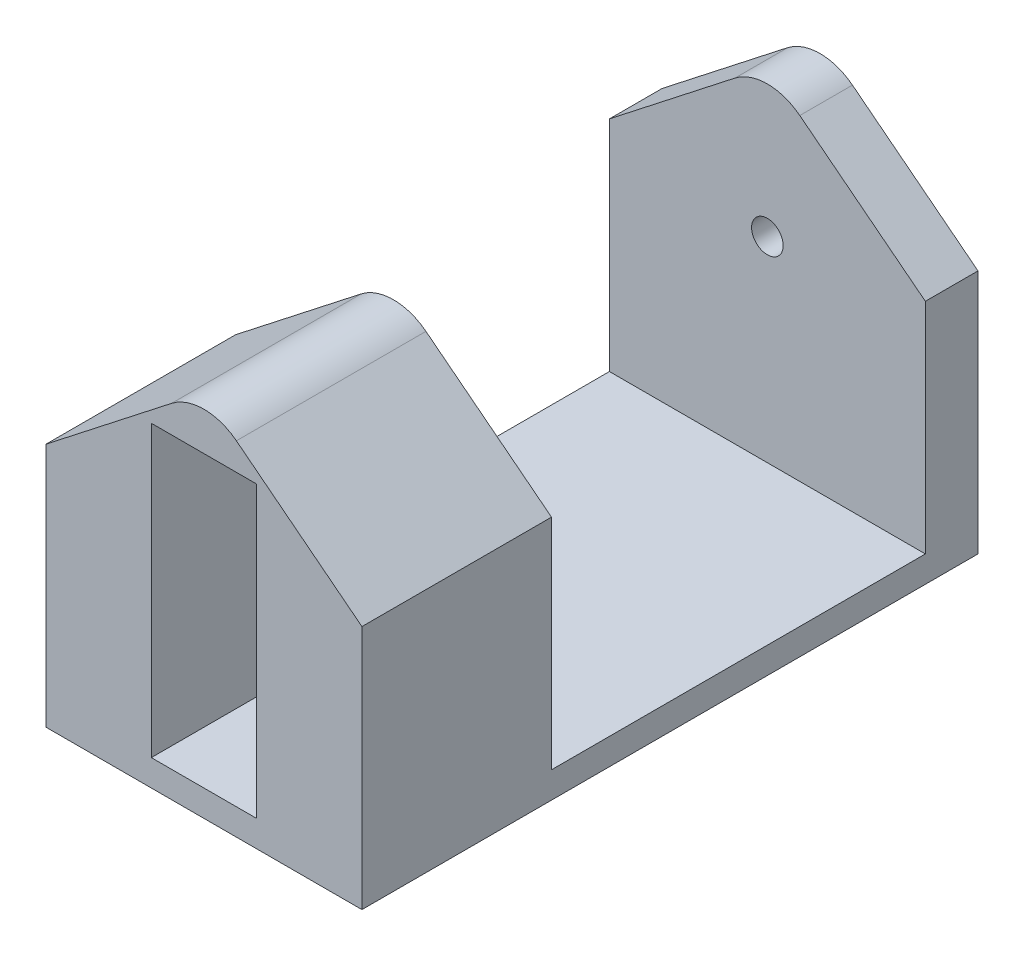
ISO-10303-21;
HEADER;
FILE_DESCRIPTION(('STEP AP214'),'2;1');
FILE_NAME('part.step','',(''),(''),'','','');
FILE_SCHEMA(('AUTOMOTIVE_DESIGN { 1 0 10303 214 1 1 1 1 }'));
ENDSEC;
DATA;
#1=APPLICATION_CONTEXT('core data for automotive mechanical design processes');
#2=APPLICATION_PROTOCOL_DEFINITION('international standard','automotive_design',2000,#1);
#3=PRODUCT_CONTEXT('',#1,'mechanical');
#4=PRODUCT('Part','Part','',(#3));
#5=PRODUCT_RELATED_PRODUCT_CATEGORY('part','',(#4));
#6=PRODUCT_DEFINITION_FORMATION('','',#4);
#7=PRODUCT_DEFINITION_CONTEXT('part definition',#1,'design');
#8=PRODUCT_DEFINITION('design','',#6,#7);
#9=PRODUCT_DEFINITION_SHAPE('','',#8);
#10=(LENGTH_UNIT() NAMED_UNIT(*) SI_UNIT(.MILLI.,.METRE.));
#11=(NAMED_UNIT(*) PLANE_ANGLE_UNIT() SI_UNIT($,.RADIAN.));
#12=(NAMED_UNIT(*) SI_UNIT($,.STERADIAN.) SOLID_ANGLE_UNIT());
#13=UNCERTAINTY_MEASURE_WITH_UNIT(LENGTH_MEASURE(1.E-05),#10,'distance_accuracy_value','');
#14=(GEOMETRIC_REPRESENTATION_CONTEXT(3) GLOBAL_UNCERTAINTY_ASSIGNED_CONTEXT((#13)) GLOBAL_UNIT_ASSIGNED_CONTEXT((#10,
#11,#12)) REPRESENTATION_CONTEXT('',''));
#15=CARTESIAN_POINT('',(0.,0.,0.));
#16=DIRECTION('',(0.,0.,1.));
#17=DIRECTION('',(1.,0.,0.));
#18=AXIS2_PLACEMENT_3D('',#15,#16,#17);
#19=CARTESIAN_POINT('',(-40.,70.,-58.5));
#20=DIRECTION('',(0.,0.,1.));
#21=DIRECTION('',(1.,0.,0.));
#22=AXIS2_PLACEMENT_3D('',#19,#20,#21);
#23=PLANE('',#22);
#24=CARTESIAN_POINT('',(0.,42.2,-58.5));
#25=DIRECTION('',(0.,0.,1.));
#26=DIRECTION('',(1.,0.,0.));
#27=AXIS2_PLACEMENT_3D('',#24,#25,#26);
#28=CIRCLE('',#27,3.);
#29=CARTESIAN_POINT('',(3.00000000000001,42.2,-58.5));
#30=VERTEX_POINT('',#29);
#31=EDGE_CURVE('E311',#30,#30,#28,.T.);
#32=ORIENTED_EDGE('',*,*,#31,.T.);
#33=EDGE_LOOP('',(#32));
#34=FACE_BOUND('',#33,.T.);
#35=DIRECTION('',(-1.,0.,0.));
#36=VECTOR('',#35,1.);
#37=CARTESIAN_POINT('',(-40.,0.,-58.5));
#38=LINE('',#37,#36);
#39=CARTESIAN_POINT('',(30.,0.,-58.5));
#40=VERTEX_POINT('',#39);
#41=CARTESIAN_POINT('',(-30.,0.,-58.5));
#42=VERTEX_POINT('',#41);
#43=EDGE_CURVE('E177',#40,#42,#38,.T.);
#44=ORIENTED_EDGE('',*,*,#43,.T.);
#45=DIRECTION('',(0.,1.,0.));
#46=VECTOR('',#45,1.);
#47=CARTESIAN_POINT('',(-30.,0.,-58.5));
#48=LINE('',#47,#46);
#49=CARTESIAN_POINT('',(-30.,46.5542287156581,-58.5));
#50=VERTEX_POINT('',#49);
#51=EDGE_CURVE('E154',#42,#50,#48,.T.);
#52=ORIENTED_EDGE('',*,*,#51,.T.);
#53=DIRECTION('',(0.787918971406133,0.615778933139404,0.));
#54=VECTOR('',#53,1.);
#55=CARTESIAN_POINT('',(-6.15778933139407,65.1875293239658,-58.5));
#56=LINE('',#55,#54);
#57=CARTESIAN_POINT('',(-6.15778933139407,65.1875293239658,-58.5));
#58=VERTEX_POINT('',#57);
#59=EDGE_CURVE('E205',#50,#58,#56,.T.);
#60=ORIENTED_EDGE('',*,*,#59,.T.);
#61=CARTESIAN_POINT('',(0.,57.3083396099045,-58.5));
#62=DIRECTION('',(0.,0.,-1.));
#63=DIRECTION('',(-1.,0.,0.));
#64=AXIS2_PLACEMENT_3D('',#61,#62,#63);
#65=CIRCLE('',#64,10.);
#66=CARTESIAN_POINT('',(6.15778933139409,65.1875293239658,-58.5));
#67=VERTEX_POINT('',#66);
#68=EDGE_CURVE('E291',#58,#67,#65,.T.);
#69=ORIENTED_EDGE('',*,*,#68,.T.);
#70=DIRECTION('',(0.787918971406133,-0.615778933139404,0.));
#71=VECTOR('',#70,1.);
#72=CARTESIAN_POINT('',(6.15778933139409,65.1875293239658,-58.5));
#73=LINE('',#72,#71);
#74=CARTESIAN_POINT('',(30.,46.5542287156581,-58.5));
#75=VERTEX_POINT('',#74);
#76=EDGE_CURVE('E286',#67,#75,#73,.T.);
#77=ORIENTED_EDGE('',*,*,#76,.T.);
#78=DIRECTION('',(0.,1.,0.));
#79=VECTOR('',#78,1.);
#80=CARTESIAN_POINT('',(30.,0.,-58.5));
#81=LINE('',#80,#79);
#82=EDGE_CURVE('E53',#40,#75,#81,.T.);
#83=ORIENTED_EDGE('',*,*,#82,.F.);
#84=EDGE_LOOP('',(#44,#52,#60,#69,#77,#83));
#85=FACE_BOUND('',#84,.T.);
#86=ADVANCED_FACE('F38',(#34,#85),#23,.F.);
#87=CARTESIAN_POINT('',(-40.,70.,58.5));
#88=DIRECTION('',(0.,0.,-1.));
#89=DIRECTION('',(-1.,0.,0.));
#90=AXIS2_PLACEMENT_3D('',#87,#88,#89);
#91=PLANE('',#90);
#92=DIRECTION('',(1.,0.,0.));
#93=VECTOR('',#92,1.);
#94=CARTESIAN_POINT('',(-9.99999999999999,5.,58.5));
#95=LINE('',#94,#93);
#96=CARTESIAN_POINT('',(-9.99999999999999,5.00000000000001,58.5));
#97=VERTEX_POINT('',#96);
#98=CARTESIAN_POINT('',(10.,5.,58.5));
#99=VERTEX_POINT('',#98);
#100=EDGE_CURVE('E231',#97,#99,#95,.T.);
#101=ORIENTED_EDGE('',*,*,#100,.F.);
#102=DIRECTION('',(0.,-1.,0.));
#103=VECTOR('',#102,1.);
#104=CARTESIAN_POINT('',(-9.99999999999999,5.,58.5));
#105=LINE('',#104,#103);
#106=CARTESIAN_POINT('',(-9.99999999999999,60.,58.5));
#107=VERTEX_POINT('',#106);
#108=EDGE_CURVE('E228',#107,#97,#105,.T.);
#109=ORIENTED_EDGE('',*,*,#108,.F.);
#110=DIRECTION('',(-1.,0.,0.));
#111=VECTOR('',#110,1.);
#112=CARTESIAN_POINT('',(-9.99999999999999,60.,58.5));
#113=LINE('',#112,#111);
#114=CARTESIAN_POINT('',(9.99999999999999,60.,58.5));
#115=VERTEX_POINT('',#114);
#116=EDGE_CURVE('E239',#115,#107,#113,.T.);
#117=ORIENTED_EDGE('',*,*,#116,.F.);
#118=DIRECTION('',(0.,1.,0.));
#119=VECTOR('',#118,1.);
#120=CARTESIAN_POINT('',(9.99999999999999,60.,58.5));
#121=LINE('',#120,#119);
#122=EDGE_CURVE('E235',#99,#115,#121,.T.);
#123=ORIENTED_EDGE('',*,*,#122,.F.);
#124=EDGE_LOOP('',(#101,#109,#117,#123));
#125=FACE_BOUND('',#124,.T.);
#126=DIRECTION('',(0.787918971406133,0.615778933139404,0.));
#127=VECTOR('',#126,1.);
#128=CARTESIAN_POINT('',(-6.15778933139407,65.1875293239658,58.5));
#129=LINE('',#128,#127);
#130=CARTESIAN_POINT('',(-30.,46.5542287156581,58.5));
#131=VERTEX_POINT('',#130);
#132=CARTESIAN_POINT('',(-6.15778933139407,65.1875293239658,58.5));
#133=VERTEX_POINT('',#132);
#134=EDGE_CURVE('E169',#131,#133,#129,.T.);
#135=ORIENTED_EDGE('',*,*,#134,.F.);
#136=DIRECTION('',(0.,1.,0.));
#137=VECTOR('',#136,1.);
#138=CARTESIAN_POINT('',(-30.,0.,58.5));
#139=LINE('',#138,#137);
#140=CARTESIAN_POINT('',(-30.,0.,58.5));
#141=VERTEX_POINT('',#140);
#142=EDGE_CURVE('E151',#141,#131,#139,.T.);
#143=ORIENTED_EDGE('',*,*,#142,.F.);
#144=DIRECTION('',(1.,0.,0.));
#145=VECTOR('',#144,1.);
#146=CARTESIAN_POINT('',(-40.,0.,58.5));
#147=LINE('',#146,#145);
#148=CARTESIAN_POINT('',(30.,0.,58.5));
#149=VERTEX_POINT('',#148);
#150=EDGE_CURVE('E167',#141,#149,#147,.T.);
#151=ORIENTED_EDGE('',*,*,#150,.T.);
#152=DIRECTION('',(0.,1.,0.));
#153=VECTOR('',#152,1.);
#154=CARTESIAN_POINT('',(30.,0.,58.5));
#155=LINE('',#154,#153);
#156=CARTESIAN_POINT('',(30.,46.5542287156581,58.5));
#157=VERTEX_POINT('',#156);
#158=EDGE_CURVE('E160',#149,#157,#155,.T.);
#159=ORIENTED_EDGE('',*,*,#158,.T.);
#160=DIRECTION('',(0.787918971406133,-0.615778933139404,0.));
#161=VECTOR('',#160,1.);
#162=CARTESIAN_POINT('',(6.15778933139409,65.1875293239658,58.5));
#163=LINE('',#162,#161);
#164=CARTESIAN_POINT('',(6.15778933139409,65.1875293239658,58.5));
#165=VERTEX_POINT('',#164);
#166=EDGE_CURVE('E314',#165,#157,#163,.T.);
#167=ORIENTED_EDGE('',*,*,#166,.F.);
#168=CARTESIAN_POINT('',(0.,57.3083396099045,58.5));
#169=DIRECTION('',(0.,0.,-1.));
#170=DIRECTION('',(-1.,0.,0.));
#171=AXIS2_PLACEMENT_3D('',#168,#169,#170);
#172=CIRCLE('',#171,10.);
#173=EDGE_CURVE('E310',#133,#165,#172,.T.);
#174=ORIENTED_EDGE('',*,*,#173,.F.);
#175=EDGE_LOOP('',(#135,#143,#151,#159,#167,#174));
#176=FACE_BOUND('',#175,.T.);
#177=ADVANCED_FACE('F165',(#125,#176),#91,.F.);
#178=CARTESIAN_POINT('',(0.,0.,0.));
#179=DIRECTION('',(0.,1.,0.));
#180=DIRECTION('',(0.,0.,1.));
#181=AXIS2_PLACEMENT_3D('',#178,#179,#180);
#182=PLANE('',#181);
#183=ORIENTED_EDGE('',*,*,#150,.F.);
#184=DIRECTION('',(0.,0.,-1.));
#185=VECTOR('',#184,1.);
#186=CARTESIAN_POINT('',(-30.,0.,58.5));
#187=LINE('',#186,#185);
#188=EDGE_CURVE('E148',#141,#42,#187,.T.);
#189=ORIENTED_EDGE('',*,*,#188,.T.);
#190=ORIENTED_EDGE('',*,*,#43,.F.);
#191=DIRECTION('',(0.,0.,1.));
#192=VECTOR('',#191,1.);
#193=CARTESIAN_POINT('',(30.,0.,58.5));
#194=LINE('',#193,#192);
#195=EDGE_CURVE('E174',#40,#149,#194,.T.);
#196=ORIENTED_EDGE('',*,*,#195,.T.);
#197=EDGE_LOOP('',(#183,#189,#190,#196));
#198=FACE_BOUND('',#197,.T.);
#199=ADVANCED_FACE('F173',(#198),#182,.F.);
#200=CARTESIAN_POINT('',(-40.,5.,-48.5));
#201=DIRECTION('',(0.,0.,-1.));
#202=DIRECTION('',(-1.,0.,0.));
#203=AXIS2_PLACEMENT_3D('',#200,#201,#202);
#204=PLANE('',#203);
#205=CARTESIAN_POINT('',(0.,42.2,-48.5));
#206=DIRECTION('',(0.,0.,1.));
#207=DIRECTION('',(1.,0.,0.));
#208=AXIS2_PLACEMENT_3D('',#205,#206,#207);
#209=CIRCLE('',#208,3.);
#210=CARTESIAN_POINT('',(3.00000000000001,42.2,-48.5));
#211=VERTEX_POINT('',#210);
#212=EDGE_CURVE('E325',#211,#211,#209,.T.);
#213=ORIENTED_EDGE('',*,*,#212,.F.);
#214=EDGE_LOOP('',(#213));
#215=FACE_BOUND('',#214,.T.);
#216=DIRECTION('',(-0.787918971406133,-0.615778933139404,0.));
#217=VECTOR('',#216,1.);
#218=CARTESIAN_POINT('',(-56.3696059548976,25.9457037130998,-48.5));
#219=LINE('',#218,#217);
#220=CARTESIAN_POINT('',(-6.15778933139407,65.1875293239658,-48.5));
#221=VERTEX_POINT('',#220);
#222=CARTESIAN_POINT('',(-30.,46.5542287156581,-48.5));
#223=VERTEX_POINT('',#222);
#224=EDGE_CURVE('E203',#221,#223,#219,.T.);
#225=ORIENTED_EDGE('',*,*,#224,.T.);
#226=DIRECTION('',(0.,-1.,0.));
#227=VECTOR('',#226,1.);
#228=CARTESIAN_POINT('',(-30.,5.,-48.5));
#229=LINE('',#228,#227);
#230=CARTESIAN_POINT('',(-30.,5.,-48.5));
#231=VERTEX_POINT('',#230);
#232=EDGE_CURVE('E60',#223,#231,#229,.T.);
#233=ORIENTED_EDGE('',*,*,#232,.T.);
#234=DIRECTION('',(-1.,0.,0.));
#235=VECTOR('',#234,1.);
#236=CARTESIAN_POINT('',(-40.,5.,-48.5));
#237=LINE('',#236,#235);
#238=CARTESIAN_POINT('',(30.,5.,-48.5));
#239=VERTEX_POINT('',#238);
#240=EDGE_CURVE('E184',#239,#231,#237,.T.);
#241=ORIENTED_EDGE('',*,*,#240,.F.);
#242=DIRECTION('',(0.,1.,0.));
#243=VECTOR('',#242,1.);
#244=CARTESIAN_POINT('',(30.,5.,-48.5));
#245=LINE('',#244,#243);
#246=CARTESIAN_POINT('',(30.,46.5542287156581,-48.5));
#247=VERTEX_POINT('',#246);
#248=EDGE_CURVE('E277',#239,#247,#245,.T.);
#249=ORIENTED_EDGE('',*,*,#248,.T.);
#250=DIRECTION('',(-0.787918971406133,0.615778933139404,0.));
#251=VECTOR('',#250,1.);
#252=CARTESIAN_POINT('',(6.70430151476178,64.760416002121,-48.5));
#253=LINE('',#252,#251);
#254=CARTESIAN_POINT('',(6.15778933139409,65.1875293239658,-48.5));
#255=VERTEX_POINT('',#254);
#256=EDGE_CURVE('E218',#247,#255,#253,.T.);
#257=ORIENTED_EDGE('',*,*,#256,.T.);
#258=CARTESIAN_POINT('',(0.,57.3083396099045,-48.5));
#259=DIRECTION('',(0.,0.,-1.));
#260=DIRECTION('',(-1.,0.,0.));
#261=AXIS2_PLACEMENT_3D('',#258,#259,#260);
#262=CIRCLE('',#261,10.);
#263=EDGE_CURVE('E212',#255,#221,#262,.F.);
#264=ORIENTED_EDGE('',*,*,#263,.T.);
#265=EDGE_LOOP('',(#225,#233,#241,#249,#257,#264));
#266=FACE_BOUND('',#265,.T.);
#267=ADVANCED_FACE('F208',(#215,#266),#204,.F.);
#268=CARTESIAN_POINT('',(-40.,5.,22.5));
#269=DIRECTION('',(0.,0.,1.));
#270=DIRECTION('',(1.,0.,0.));
#271=AXIS2_PLACEMENT_3D('',#268,#269,#270);
#272=PLANE('',#271);
#273=DIRECTION('',(1.,0.,0.));
#274=VECTOR('',#273,1.);
#275=CARTESIAN_POINT('',(-40.,5.,22.5));
#276=LINE('',#275,#274);
#277=CARTESIAN_POINT('',(-30.,5.,22.5));
#278=VERTEX_POINT('',#277);
#279=CARTESIAN_POINT('',(-9.99999999999999,5.,22.5));
#280=VERTEX_POINT('',#279);
#281=EDGE_CURVE('E265',#278,#280,#276,.T.);
#282=ORIENTED_EDGE('',*,*,#281,.F.);
#283=DIRECTION('',(0.,1.,0.));
#284=VECTOR('',#283,1.);
#285=CARTESIAN_POINT('',(-30.,5.,22.5));
#286=LINE('',#285,#284);
#287=CARTESIAN_POINT('',(-30.,46.5542287156581,22.5));
#288=VERTEX_POINT('',#287);
#289=EDGE_CURVE('E340',#278,#288,#286,.T.);
#290=ORIENTED_EDGE('',*,*,#289,.T.);
#291=DIRECTION('',(0.787918971406133,0.615778933139404,0.));
#292=VECTOR('',#291,1.);
#293=CARTESIAN_POINT('',(-56.3696059548976,25.9457037130998,22.5));
#294=LINE('',#293,#292);
#295=CARTESIAN_POINT('',(-6.15778933139407,65.1875293239658,22.5));
#296=VERTEX_POINT('',#295);
#297=EDGE_CURVE('E182',#288,#296,#294,.T.);
#298=ORIENTED_EDGE('',*,*,#297,.T.);
#299=CARTESIAN_POINT('',(0.,57.3083396099045,22.5));
#300=DIRECTION('',(0.,0.,1.));
#301=DIRECTION('',(1.,0.,0.));
#302=AXIS2_PLACEMENT_3D('',#299,#300,#301);
#303=CIRCLE('',#302,10.);
#304=CARTESIAN_POINT('',(6.15778933139409,65.1875293239658,22.5));
#305=VERTEX_POINT('',#304);
#306=EDGE_CURVE('E190',#296,#305,#303,.F.);
#307=ORIENTED_EDGE('',*,*,#306,.T.);
#308=DIRECTION('',(0.787918971406133,-0.615778933139404,0.));
#309=VECTOR('',#308,1.);
#310=CARTESIAN_POINT('',(6.70430151476178,64.760416002121,22.5));
#311=LINE('',#310,#309);
#312=CARTESIAN_POINT('',(30.,46.5542287156581,22.5));
#313=VERTEX_POINT('',#312);
#314=EDGE_CURVE('E194',#305,#313,#311,.T.);
#315=ORIENTED_EDGE('',*,*,#314,.T.);
#316=DIRECTION('',(0.,-1.,0.));
#317=VECTOR('',#316,1.);
#318=CARTESIAN_POINT('',(30.,5.,22.5));
#319=LINE('',#318,#317);
#320=CARTESIAN_POINT('',(30.,5.,22.5));
#321=VERTEX_POINT('',#320);
#322=EDGE_CURVE('E332',#313,#321,#319,.T.);
#323=ORIENTED_EDGE('',*,*,#322,.T.);
#324=CARTESIAN_POINT('',(10.,5.,22.5));
#325=VERTEX_POINT('',#324);
#326=EDGE_CURVE('E264',#325,#321,#276,.T.);
#327=ORIENTED_EDGE('',*,*,#326,.F.);
#328=DIRECTION('',(0.,1.,0.));
#329=VECTOR('',#328,1.);
#330=CARTESIAN_POINT('',(10.,5.00000000000002,22.5));
#331=LINE('',#330,#329);
#332=CARTESIAN_POINT('',(9.99999999999999,60.,22.5));
#333=VERTEX_POINT('',#332);
#334=EDGE_CURVE('E247',#325,#333,#331,.T.);
#335=ORIENTED_EDGE('',*,*,#334,.T.);
#336=DIRECTION('',(-1.,0.,0.));
#337=VECTOR('',#336,1.);
#338=CARTESIAN_POINT('',(-40.,60.,22.5));
#339=LINE('',#338,#337);
#340=CARTESIAN_POINT('',(-9.99999999999999,60.,22.5));
#341=VERTEX_POINT('',#340);
#342=EDGE_CURVE('E176',#333,#341,#339,.T.);
#343=ORIENTED_EDGE('',*,*,#342,.T.);
#344=DIRECTION('',(0.,-1.,0.));
#345=VECTOR('',#344,1.);
#346=CARTESIAN_POINT('',(-9.99999999999999,5.,22.5));
#347=LINE('',#346,#345);
#348=EDGE_CURVE('E260',#341,#280,#347,.T.);
#349=ORIENTED_EDGE('',*,*,#348,.T.);
#350=EDGE_LOOP('',(#282,#290,#298,#307,#315,#323,#327,#335,#343,#349));
#351=FACE_BOUND('',#350,.T.);
#352=ADVANCED_FACE('F397',(#351),#272,.F.);
#353=CARTESIAN_POINT('',(0.,5.,0.));
#354=DIRECTION('',(0.,1.,0.));
#355=DIRECTION('',(0.,0.,1.));
#356=AXIS2_PLACEMENT_3D('',#353,#354,#355);
#357=PLANE('',#356);
#358=DIRECTION('',(0.,0.,-1.));
#359=VECTOR('',#358,1.);
#360=CARTESIAN_POINT('',(-30.,5.,0.));
#361=LINE('',#360,#359);
#362=EDGE_CURVE('E272',#278,#231,#361,.T.);
#363=ORIENTED_EDGE('',*,*,#362,.F.);
#364=ORIENTED_EDGE('',*,*,#281,.T.);
#365=DIRECTION('',(0.,0.,1.));
#366=VECTOR('',#365,1.);
#367=CARTESIAN_POINT('',(-9.99999999999999,5.,-6.50000000000001));
#368=LINE('',#367,#366);
#369=EDGE_CURVE('E243',#280,#97,#368,.T.);
#370=ORIENTED_EDGE('',*,*,#369,.T.);
#371=ORIENTED_EDGE('',*,*,#100,.T.);
#372=DIRECTION('',(0.,0.,1.));
#373=VECTOR('',#372,1.);
#374=CARTESIAN_POINT('',(10.,5.,-6.50000000000001));
#375=LINE('',#374,#373);
#376=EDGE_CURVE('E251',#325,#99,#375,.T.);
#377=ORIENTED_EDGE('',*,*,#376,.F.);
#378=ORIENTED_EDGE('',*,*,#326,.T.);
#379=DIRECTION('',(0.,0.,1.));
#380=VECTOR('',#379,1.);
#381=CARTESIAN_POINT('',(30.,5.,0.));
#382=LINE('',#381,#380);
#383=EDGE_CURVE('E275',#239,#321,#382,.T.);
#384=ORIENTED_EDGE('',*,*,#383,.F.);
#385=ORIENTED_EDGE('',*,*,#240,.T.);
#386=EDGE_LOOP('',(#363,#364,#370,#371,#377,#378,#384,#385));
#387=FACE_BOUND('',#386,.T.);
#388=ADVANCED_FACE('F271',(#387),#357,.T.);
#389=CARTESIAN_POINT('',(-9.99999999999999,60.,-6.50000000000001));
#390=DIRECTION('',(0.,1.,0.));
#391=DIRECTION('',(-1.,0.,0.));
#392=AXIS2_PLACEMENT_3D('',#389,#390,#391);
#393=PLANE('',#392);
#394=DIRECTION('',(0.,0.,1.));
#395=VECTOR('',#394,1.);
#396=CARTESIAN_POINT('',(9.99999999999999,60.,-6.50000000000001));
#397=LINE('',#396,#395);
#398=EDGE_CURVE('E248',#333,#115,#397,.T.);
#399=ORIENTED_EDGE('',*,*,#398,.T.);
#400=ORIENTED_EDGE('',*,*,#116,.T.);
#401=DIRECTION('',(0.,0.,1.));
#402=VECTOR('',#401,1.);
#403=CARTESIAN_POINT('',(-9.99999999999999,60.,-6.50000000000001));
#404=LINE('',#403,#402);
#405=EDGE_CURVE('E244',#341,#107,#404,.T.);
#406=ORIENTED_EDGE('',*,*,#405,.F.);
#407=ORIENTED_EDGE('',*,*,#342,.F.);
#408=EDGE_LOOP('',(#399,#400,#406,#407));
#409=FACE_BOUND('',#408,.T.);
#410=ADVANCED_FACE('F383',(#409),#393,.F.);
#411=CARTESIAN_POINT('',(-9.99999999999999,5.,-6.50000000000001));
#412=DIRECTION('',(-1.,0.,0.));
#413=DIRECTION('',(0.,0.,1.));
#414=AXIS2_PLACEMENT_3D('',#411,#412,#413);
#415=PLANE('',#414);
#416=ORIENTED_EDGE('',*,*,#405,.T.);
#417=ORIENTED_EDGE('',*,*,#108,.T.);
#418=ORIENTED_EDGE('',*,*,#369,.F.);
#419=ORIENTED_EDGE('',*,*,#348,.F.);
#420=EDGE_LOOP('',(#416,#417,#418,#419));
#421=FACE_BOUND('',#420,.T.);
#422=ADVANCED_FACE('F386',(#421),#415,.F.);
#423=CARTESIAN_POINT('',(9.99999999999999,60.,-6.50000000000001));
#424=DIRECTION('',(1.,0.,0.));
#425=DIRECTION('',(0.,1.,0.));
#426=AXIS2_PLACEMENT_3D('',#423,#424,#425);
#427=PLANE('',#426);
#428=ORIENTED_EDGE('',*,*,#376,.T.);
#429=ORIENTED_EDGE('',*,*,#122,.T.);
#430=ORIENTED_EDGE('',*,*,#398,.F.);
#431=ORIENTED_EDGE('',*,*,#334,.F.);
#432=EDGE_LOOP('',(#428,#429,#430,#431));
#433=FACE_BOUND('',#432,.T.);
#434=ADVANCED_FACE('F388',(#433),#427,.F.);
#435=CARTESIAN_POINT('',(-6.15778933139407,65.1875293239658,-58.5));
#436=DIRECTION('',(0.615778933139404,-0.787918971406132,0.));
#437=DIRECTION('',(0.787918971406133,0.615778933139404,0.));
#438=AXIS2_PLACEMENT_3D('',#435,#436,#437);
#439=PLANE('',#438);
#440=ORIENTED_EDGE('',*,*,#297,.F.);
#441=DIRECTION('',(0.,0.,1.));
#442=VECTOR('',#441,1.);
#443=CARTESIAN_POINT('',(-30.,46.5542287156581,-58.5));
#444=LINE('',#443,#442);
#445=EDGE_CURVE('E280',#288,#131,#444,.T.);
#446=ORIENTED_EDGE('',*,*,#445,.T.);
#447=ORIENTED_EDGE('',*,*,#134,.T.);
#448=DIRECTION('',(0.,0.,1.));
#449=VECTOR('',#448,1.);
#450=CARTESIAN_POINT('',(-6.15778933139407,65.1875293239658,-58.5));
#451=LINE('',#450,#449);
#452=EDGE_CURVE('E293',#296,#133,#451,.T.);
#453=ORIENTED_EDGE('',*,*,#452,.F.);
#454=EDGE_LOOP('',(#440,#446,#447,#453));
#455=FACE_BOUND('',#454,.T.);
#456=ADVANCED_FACE('F374',(#455),#439,.F.);
#457=CARTESIAN_POINT('',(0.,57.3083396099045,-58.5));
#458=DIRECTION('',(0.,0.,1.));
#459=DIRECTION('',(1.,0.,0.));
#460=AXIS2_PLACEMENT_3D('',#457,#458,#459);
#461=CYLINDRICAL_SURFACE('',#460,10.);
#462=ORIENTED_EDGE('',*,*,#452,.T.);
#463=ORIENTED_EDGE('',*,*,#173,.T.);
#464=DIRECTION('',(0.,0.,1.));
#465=VECTOR('',#464,1.);
#466=CARTESIAN_POINT('',(6.15778933139409,65.1875293239658,-58.5));
#467=LINE('',#466,#465);
#468=EDGE_CURVE('E221',#305,#165,#467,.T.);
#469=ORIENTED_EDGE('',*,*,#468,.F.);
#470=ORIENTED_EDGE('',*,*,#306,.F.);
#471=EDGE_LOOP('',(#462,#463,#469,#470));
#472=FACE_BOUND('',#471,.T.);
#473=ADVANCED_FACE('F381',(#472),#461,.T.);
#474=CARTESIAN_POINT('',(6.15778933139409,65.1875293239658,-58.5));
#475=DIRECTION('',(-0.615778933139404,-0.787918971406132,0.));
#476=DIRECTION('',(0.787918971406133,-0.615778933139404,0.));
#477=AXIS2_PLACEMENT_3D('',#474,#475,#476);
#478=PLANE('',#477);
#479=ORIENTED_EDGE('',*,*,#166,.T.);
#480=DIRECTION('',(0.,0.,-1.));
#481=VECTOR('',#480,1.);
#482=CARTESIAN_POINT('',(30.,46.5542287156581,-58.5));
#483=LINE('',#482,#481);
#484=EDGE_CURVE('E329',#157,#313,#483,.T.);
#485=ORIENTED_EDGE('',*,*,#484,.T.);
#486=ORIENTED_EDGE('',*,*,#314,.F.);
#487=ORIENTED_EDGE('',*,*,#468,.T.);
#488=EDGE_LOOP('',(#479,#485,#486,#487));
#489=FACE_BOUND('',#488,.T.);
#490=ADVANCED_FACE('F379',(#489),#478,.F.);
#491=ORIENTED_EDGE('',*,*,#256,.F.);
#492=DIRECTION('',(0.,0.,-1.));
#493=VECTOR('',#492,1.);
#494=CARTESIAN_POINT('',(30.,46.5542287156581,-58.5));
#495=LINE('',#494,#493);
#496=EDGE_CURVE('E11',#247,#75,#495,.T.);
#497=ORIENTED_EDGE('',*,*,#496,.T.);
#498=ORIENTED_EDGE('',*,*,#76,.F.);
#499=EDGE_CURVE('E214',#67,#255,#467,.T.);
#500=ORIENTED_EDGE('',*,*,#499,.T.);
#501=EDGE_LOOP('',(#491,#497,#498,#500));
#502=FACE_BOUND('',#501,.T.);
#503=ADVANCED_FACE('F283',(#502),#478,.F.);
#504=ORIENTED_EDGE('',*,*,#499,.F.);
#505=ORIENTED_EDGE('',*,*,#68,.F.);
#506=EDGE_CURVE('E224',#58,#221,#451,.T.);
#507=ORIENTED_EDGE('',*,*,#506,.T.);
#508=ORIENTED_EDGE('',*,*,#263,.F.);
#509=EDGE_LOOP('',(#504,#505,#507,#508));
#510=FACE_BOUND('',#509,.T.);
#511=ADVANCED_FACE('F290',(#510),#461,.T.);
#512=ORIENTED_EDGE('',*,*,#59,.F.);
#513=DIRECTION('',(0.,0.,1.));
#514=VECTOR('',#513,1.);
#515=CARTESIAN_POINT('',(-30.,46.5542287156581,-58.5));
#516=LINE('',#515,#514);
#517=EDGE_CURVE('E46',#50,#223,#516,.T.);
#518=ORIENTED_EDGE('',*,*,#517,.T.);
#519=ORIENTED_EDGE('',*,*,#224,.F.);
#520=ORIENTED_EDGE('',*,*,#506,.F.);
#521=EDGE_LOOP('',(#512,#518,#519,#520));
#522=FACE_BOUND('',#521,.T.);
#523=ADVANCED_FACE('F201',(#522),#439,.F.);
#524=CARTESIAN_POINT('',(0.,42.2,-113.5));
#525=DIRECTION('',(0.,0.,1.));
#526=DIRECTION('',(1.,0.,0.));
#527=AXIS2_PLACEMENT_3D('',#524,#525,#526);
#528=CYLINDRICAL_SURFACE('',#527,3.);
#529=ORIENTED_EDGE('',*,*,#212,.T.);
#530=EDGE_LOOP('',(#529));
#531=FACE_BOUND('',#530,.T.);
#532=ORIENTED_EDGE('',*,*,#31,.F.);
#533=EDGE_LOOP('',(#532));
#534=FACE_BOUND('',#533,.T.);
#535=ADVANCED_FACE('F363',(#531,#534),#528,.F.);
#536=CARTESIAN_POINT('',(-30.,0.,58.5));
#537=DIRECTION('',(1.,0.,0.));
#538=DIRECTION('',(0.,0.,-1.));
#539=AXIS2_PLACEMENT_3D('',#536,#537,#538);
#540=PLANE('',#539);
#541=ORIENTED_EDGE('',*,*,#289,.F.);
#542=ORIENTED_EDGE('',*,*,#362,.T.);
#543=ORIENTED_EDGE('',*,*,#232,.F.);
#544=ORIENTED_EDGE('',*,*,#517,.F.);
#545=ORIENTED_EDGE('',*,*,#51,.F.);
#546=ORIENTED_EDGE('',*,*,#188,.F.);
#547=ORIENTED_EDGE('',*,*,#142,.T.);
#548=ORIENTED_EDGE('',*,*,#445,.F.);
#549=EDGE_LOOP('',(#541,#542,#543,#544,#545,#546,#547,#548));
#550=FACE_BOUND('',#549,.T.);
#551=ADVANCED_FACE('F150',(#550),#540,.F.);
#552=CARTESIAN_POINT('',(30.,0.,58.5));
#553=DIRECTION('',(-1.,0.,0.));
#554=DIRECTION('',(0.,0.,1.));
#555=AXIS2_PLACEMENT_3D('',#552,#553,#554);
#556=PLANE('',#555);
#557=ORIENTED_EDGE('',*,*,#158,.F.);
#558=ORIENTED_EDGE('',*,*,#195,.F.);
#559=ORIENTED_EDGE('',*,*,#82,.T.);
#560=ORIENTED_EDGE('',*,*,#496,.F.);
#561=ORIENTED_EDGE('',*,*,#248,.F.);
#562=ORIENTED_EDGE('',*,*,#383,.T.);
#563=ORIENTED_EDGE('',*,*,#322,.F.);
#564=ORIENTED_EDGE('',*,*,#484,.F.);
#565=EDGE_LOOP('',(#557,#558,#559,#560,#561,#562,#563,#564));
#566=FACE_BOUND('',#565,.T.);
#567=ADVANCED_FACE('F371',(#566),#556,.F.);
#568=CLOSED_SHELL('',(#86,#177,#199,#267,#352,#388,#410,#422,#434,#456,#473,#490,#503,#511,#523,
#535,#551,#567));
#569=MANIFOLD_SOLID_BREP('B2',#568);
#570=ADVANCED_BREP_SHAPE_REPRESENTATION('',(#18,#569),#14);
#571=SHAPE_DEFINITION_REPRESENTATION(#9,#570);
ENDSEC;
END-ISO-10303-21;
